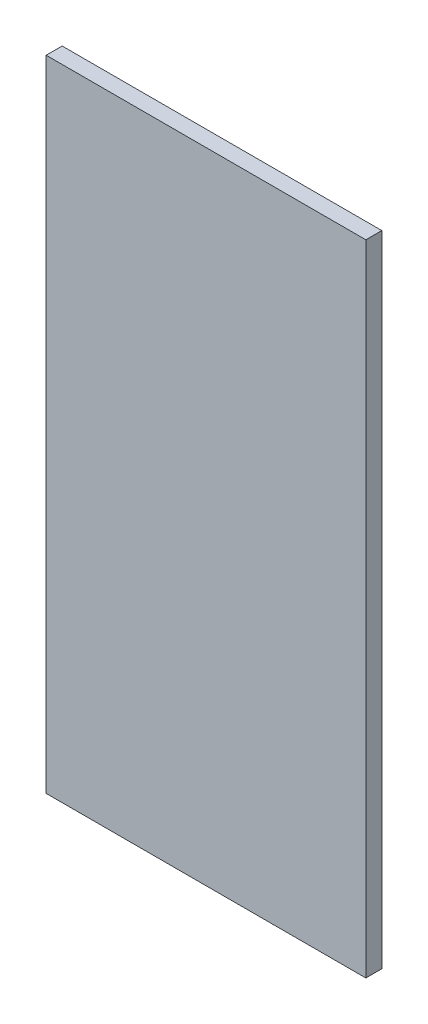
ISO-10303-21;
HEADER;
FILE_DESCRIPTION(('STEP AP214'),'2;1');
FILE_NAME('part.step','',(''),(''),'','','');
FILE_SCHEMA(('AUTOMOTIVE_DESIGN { 1 0 10303 214 1 1 1 1 }'));
ENDSEC;
DATA;
#1=APPLICATION_CONTEXT('core data for automotive mechanical design processes');
#2=APPLICATION_PROTOCOL_DEFINITION('international standard','automotive_design',2000,#1);
#3=PRODUCT_CONTEXT('',#1,'mechanical');
#4=PRODUCT('Part','Part','',(#3));
#5=PRODUCT_RELATED_PRODUCT_CATEGORY('part','',(#4));
#6=PRODUCT_DEFINITION_FORMATION('','',#4);
#7=PRODUCT_DEFINITION_CONTEXT('part definition',#1,'design');
#8=PRODUCT_DEFINITION('design','',#6,#7);
#9=PRODUCT_DEFINITION_SHAPE('','',#8);
#10=(LENGTH_UNIT() NAMED_UNIT(*) SI_UNIT(.MILLI.,.METRE.));
#11=(NAMED_UNIT(*) PLANE_ANGLE_UNIT() SI_UNIT($,.RADIAN.));
#12=(NAMED_UNIT(*) SI_UNIT($,.STERADIAN.) SOLID_ANGLE_UNIT());
#13=UNCERTAINTY_MEASURE_WITH_UNIT(LENGTH_MEASURE(1.E-05),#10,'distance_accuracy_value','');
#14=(GEOMETRIC_REPRESENTATION_CONTEXT(3) GLOBAL_UNCERTAINTY_ASSIGNED_CONTEXT((#13)) GLOBAL_UNIT_ASSIGNED_CONTEXT((#10,
#11,#12)) REPRESENTATION_CONTEXT('',''));
#15=CARTESIAN_POINT('',(0.,0.,0.));
#16=DIRECTION('',(0.,0.,1.));
#17=DIRECTION('',(1.,0.,0.));
#18=AXIS2_PLACEMENT_3D('',#15,#16,#17);
#19=CARTESIAN_POINT('',(0.,0.,5.));
#20=DIRECTION('',(1.,0.,0.));
#21=DIRECTION('',(0.,0.,-1.));
#22=AXIS2_PLACEMENT_3D('',#19,#20,#21);
#23=PLANE('',#22);
#24=DIRECTION('',(0.,-1.,0.));
#25=VECTOR('',#24,1.);
#26=CARTESIAN_POINT('',(0.,0.,0.));
#27=LINE('',#26,#25);
#28=CARTESIAN_POINT('',(0.,200.,0.));
#29=VERTEX_POINT('',#28);
#30=CARTESIAN_POINT('',(0.,0.,0.));
#31=VERTEX_POINT('',#30);
#32=EDGE_CURVE('E98',#29,#31,#27,.T.);
#33=ORIENTED_EDGE('',*,*,#32,.T.);
#34=DIRECTION('',(0.,0.,-1.));
#35=VECTOR('',#34,1.);
#36=CARTESIAN_POINT('',(0.,0.,5.));
#37=LINE('',#36,#35);
#38=CARTESIAN_POINT('',(0.,0.,5.));
#39=VERTEX_POINT('',#38);
#40=EDGE_CURVE('E11',#39,#31,#37,.T.);
#41=ORIENTED_EDGE('',*,*,#40,.F.);
#42=DIRECTION('',(0.,-1.,0.));
#43=VECTOR('',#42,1.);
#44=CARTESIAN_POINT('',(0.,0.,5.));
#45=LINE('',#44,#43);
#46=CARTESIAN_POINT('',(0.,200.,5.));
#47=VERTEX_POINT('',#46);
#48=EDGE_CURVE('E86',#47,#39,#45,.T.);
#49=ORIENTED_EDGE('',*,*,#48,.F.);
#50=DIRECTION('',(0.,0.,-1.));
#51=VECTOR('',#50,1.);
#52=CARTESIAN_POINT('',(0.,200.,5.));
#53=LINE('',#52,#51);
#54=EDGE_CURVE('E94',#47,#29,#53,.T.);
#55=ORIENTED_EDGE('',*,*,#54,.T.);
#56=EDGE_LOOP('',(#33,#41,#49,#55));
#57=FACE_BOUND('',#56,.T.);
#58=ADVANCED_FACE('F35',(#57),#23,.F.);
#59=CARTESIAN_POINT('',(0.,0.,5.));
#60=DIRECTION('',(0.,1.,0.));
#61=DIRECTION('',(0.,0.,1.));
#62=AXIS2_PLACEMENT_3D('',#59,#60,#61);
#63=PLANE('',#62);
#64=DIRECTION('',(1.,0.,0.));
#65=VECTOR('',#64,1.);
#66=CARTESIAN_POINT('',(0.,0.,0.));
#67=LINE('',#66,#65);
#68=CARTESIAN_POINT('',(100.,0.,0.));
#69=VERTEX_POINT('',#68);
#70=EDGE_CURVE('E90',#31,#69,#67,.T.);
#71=ORIENTED_EDGE('',*,*,#70,.T.);
#72=DIRECTION('',(0.,0.,-1.));
#73=VECTOR('',#72,1.);
#74=CARTESIAN_POINT('',(100.,0.,5.));
#75=LINE('',#74,#73);
#76=CARTESIAN_POINT('',(100.,0.,5.));
#77=VERTEX_POINT('',#76);
#78=EDGE_CURVE('E43',#77,#69,#75,.T.);
#79=ORIENTED_EDGE('',*,*,#78,.F.);
#80=DIRECTION('',(1.,0.,0.));
#81=VECTOR('',#80,1.);
#82=CARTESIAN_POINT('',(0.,0.,5.));
#83=LINE('',#82,#81);
#84=EDGE_CURVE('E81',#39,#77,#83,.T.);
#85=ORIENTED_EDGE('',*,*,#84,.F.);
#86=ORIENTED_EDGE('',*,*,#40,.T.);
#87=EDGE_LOOP('',(#71,#79,#85,#86));
#88=FACE_BOUND('',#87,.T.);
#89=ADVANCED_FACE('F89',(#88),#63,.F.);
#90=CARTESIAN_POINT('',(100.,0.,5.));
#91=DIRECTION('',(-1.,0.,0.));
#92=DIRECTION('',(0.,0.,1.));
#93=AXIS2_PLACEMENT_3D('',#90,#91,#92);
#94=PLANE('',#93);
#95=DIRECTION('',(0.,1.,0.));
#96=VECTOR('',#95,1.);
#97=CARTESIAN_POINT('',(100.,0.,0.));
#98=LINE('',#97,#96);
#99=CARTESIAN_POINT('',(100.,200.,0.));
#100=VERTEX_POINT('',#99);
#101=EDGE_CURVE('E68',#69,#100,#98,.T.);
#102=ORIENTED_EDGE('',*,*,#101,.T.);
#103=DIRECTION('',(0.,0.,-1.));
#104=VECTOR('',#103,1.);
#105=CARTESIAN_POINT('',(100.,200.,5.));
#106=LINE('',#105,#104);
#107=CARTESIAN_POINT('',(100.,200.,5.));
#108=VERTEX_POINT('',#107);
#109=EDGE_CURVE('E91',#108,#100,#106,.T.);
#110=ORIENTED_EDGE('',*,*,#109,.F.);
#111=DIRECTION('',(0.,1.,0.));
#112=VECTOR('',#111,1.);
#113=CARTESIAN_POINT('',(100.,0.,5.));
#114=LINE('',#113,#112);
#115=EDGE_CURVE('E84',#77,#108,#114,.T.);
#116=ORIENTED_EDGE('',*,*,#115,.F.);
#117=ORIENTED_EDGE('',*,*,#78,.T.);
#118=EDGE_LOOP('',(#102,#110,#116,#117));
#119=FACE_BOUND('',#118,.T.);
#120=ADVANCED_FACE('F92',(#119),#94,.F.);
#121=CARTESIAN_POINT('',(0.,200.,5.));
#122=DIRECTION('',(0.,-1.,0.));
#123=DIRECTION('',(0.,0.,-1.));
#124=AXIS2_PLACEMENT_3D('',#121,#122,#123);
#125=PLANE('',#124);
#126=DIRECTION('',(-1.,0.,0.));
#127=VECTOR('',#126,1.);
#128=CARTESIAN_POINT('',(0.,200.,0.));
#129=LINE('',#128,#127);
#130=EDGE_CURVE('E74',#100,#29,#129,.T.);
#131=ORIENTED_EDGE('',*,*,#130,.T.);
#132=ORIENTED_EDGE('',*,*,#54,.F.);
#133=DIRECTION('',(-1.,0.,0.));
#134=VECTOR('',#133,1.);
#135=CARTESIAN_POINT('',(0.,200.,5.));
#136=LINE('',#135,#134);
#137=EDGE_CURVE('E51',#108,#47,#136,.T.);
#138=ORIENTED_EDGE('',*,*,#137,.F.);
#139=ORIENTED_EDGE('',*,*,#109,.T.);
#140=EDGE_LOOP('',(#131,#132,#138,#139));
#141=FACE_BOUND('',#140,.T.);
#142=ADVANCED_FACE('F105',(#141),#125,.F.);
#143=CARTESIAN_POINT('',(0.,0.,5.));
#144=DIRECTION('',(0.,0.,-1.));
#145=DIRECTION('',(-1.,0.,0.));
#146=AXIS2_PLACEMENT_3D('',#143,#144,#145);
#147=PLANE('',#146);
#148=ORIENTED_EDGE('',*,*,#48,.T.);
#149=ORIENTED_EDGE('',*,*,#84,.T.);
#150=ORIENTED_EDGE('',*,*,#115,.T.);
#151=ORIENTED_EDGE('',*,*,#137,.T.);
#152=EDGE_LOOP('',(#148,#149,#150,#151));
#153=FACE_BOUND('',#152,.T.);
#154=ADVANCED_FACE('F82',(#153),#147,.F.);
#155=CARTESIAN_POINT('',(0.,0.,0.));
#156=DIRECTION('',(0.,0.,-1.));
#157=DIRECTION('',(-1.,0.,0.));
#158=AXIS2_PLACEMENT_3D('',#155,#156,#157);
#159=PLANE('',#158);
#160=ORIENTED_EDGE('',*,*,#32,.F.);
#161=ORIENTED_EDGE('',*,*,#130,.F.);
#162=ORIENTED_EDGE('',*,*,#101,.F.);
#163=ORIENTED_EDGE('',*,*,#70,.F.);
#164=EDGE_LOOP('',(#160,#161,#162,#163));
#165=FACE_BOUND('',#164,.T.);
#166=ADVANCED_FACE('F108',(#165),#159,.T.);
#167=CLOSED_SHELL('',(#58,#89,#120,#142,#154,#166));
#168=MANIFOLD_SOLID_BREP('B2',#167);
#169=ADVANCED_BREP_SHAPE_REPRESENTATION('',(#18,#168),#14);
#170=SHAPE_DEFINITION_REPRESENTATION(#9,#169);
ENDSEC;
END-ISO-10303-21;
